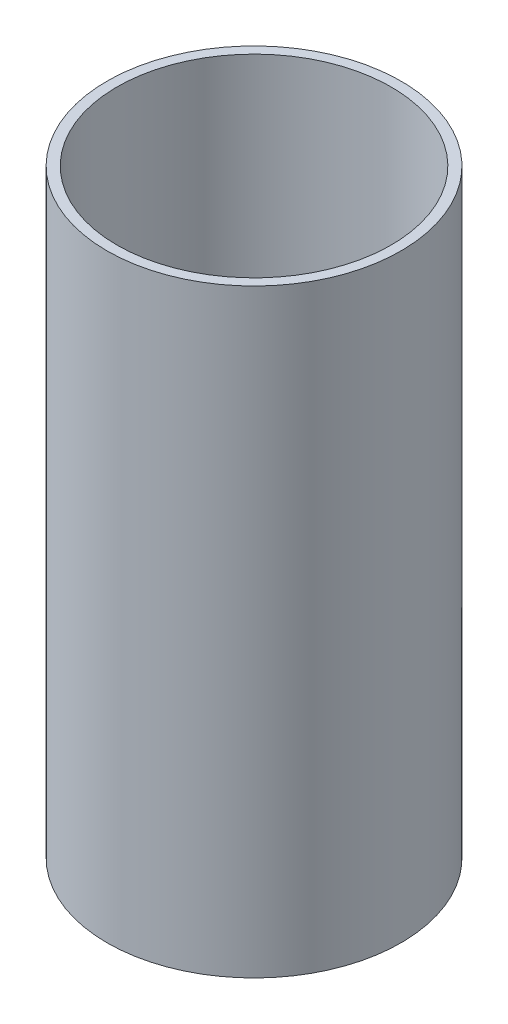
ISO-10303-21;
HEADER;
FILE_DESCRIPTION(('STEP AP214'),'2;1');
FILE_NAME('part.step','',(''),(''),'','','');
FILE_SCHEMA(('AUTOMOTIVE_DESIGN { 1 0 10303 214 1 1 1 1 }'));
ENDSEC;
DATA;
#1=APPLICATION_CONTEXT('core data for automotive mechanical design processes');
#2=APPLICATION_PROTOCOL_DEFINITION('international standard','automotive_design',2000,#1);
#3=PRODUCT_CONTEXT('',#1,'mechanical');
#4=PRODUCT('Part','Part','',(#3));
#5=PRODUCT_RELATED_PRODUCT_CATEGORY('part','',(#4));
#6=PRODUCT_DEFINITION_FORMATION('','',#4);
#7=PRODUCT_DEFINITION_CONTEXT('part definition',#1,'design');
#8=PRODUCT_DEFINITION('design','',#6,#7);
#9=PRODUCT_DEFINITION_SHAPE('','',#8);
#10=(LENGTH_UNIT() NAMED_UNIT(*) SI_UNIT(.MILLI.,.METRE.));
#11=(NAMED_UNIT(*) PLANE_ANGLE_UNIT() SI_UNIT($,.RADIAN.));
#12=(NAMED_UNIT(*) SI_UNIT($,.STERADIAN.) SOLID_ANGLE_UNIT());
#13=UNCERTAINTY_MEASURE_WITH_UNIT(LENGTH_MEASURE(1.E-05),#10,'distance_accuracy_value','');
#14=(GEOMETRIC_REPRESENTATION_CONTEXT(3) GLOBAL_UNCERTAINTY_ASSIGNED_CONTEXT((#13)) GLOBAL_UNIT_ASSIGNED_CONTEXT((#10,
#11,#12)) REPRESENTATION_CONTEXT('',''));
#15=CARTESIAN_POINT('',(0.,0.,0.));
#16=DIRECTION('',(0.,0.,1.));
#17=DIRECTION('',(1.,0.,0.));
#18=AXIS2_PLACEMENT_3D('',#15,#16,#17);
#19=CARTESIAN_POINT('',(0.,300.,0.));
#20=DIRECTION('',(0.,1.,0.));
#21=DIRECTION('',(0.,0.,1.));
#22=AXIS2_PLACEMENT_3D('',#19,#20,#21);
#23=PLANE('',#22);
#24=CARTESIAN_POINT('',(0.,300.,0.));
#25=DIRECTION('',(0.,1.,0.));
#26=DIRECTION('',(0.,0.,1.));
#27=AXIS2_PLACEMENT_3D('',#24,#25,#26);
#28=CIRCLE('',#27,73.61);
#29=CARTESIAN_POINT('',(0.,300.,73.61));
#30=VERTEX_POINT('',#29);
#31=EDGE_CURVE('E10',#30,#30,#28,.T.);
#32=ORIENTED_EDGE('',*,*,#31,.T.);
#33=EDGE_LOOP('',(#32));
#34=FACE_BOUND('',#33,.T.);
#35=CARTESIAN_POINT('',(0.,300.,0.));
#36=DIRECTION('',(0.,1.,0.));
#37=DIRECTION('',(0.,0.,1.));
#38=AXIS2_PLACEMENT_3D('',#35,#36,#37);
#39=CIRCLE('',#38,68.61);
#40=CARTESIAN_POINT('',(0.,300.,68.61));
#41=VERTEX_POINT('',#40);
#42=EDGE_CURVE('E44',#41,#41,#39,.T.);
#43=ORIENTED_EDGE('',*,*,#42,.F.);
#44=EDGE_LOOP('',(#43));
#45=FACE_BOUND('',#44,.T.);
#46=ADVANCED_FACE('F33',(#34,#45),#23,.T.);
#47=CARTESIAN_POINT('',(0.,0.,0.));
#48=DIRECTION('',(0.,1.,0.));
#49=DIRECTION('',(0.,0.,1.));
#50=AXIS2_PLACEMENT_3D('',#47,#48,#49);
#51=PLANE('',#50);
#52=CARTESIAN_POINT('',(0.,0.,0.));
#53=DIRECTION('',(0.,1.,0.));
#54=DIRECTION('',(0.,0.,1.));
#55=AXIS2_PLACEMENT_3D('',#52,#53,#54);
#56=CIRCLE('',#55,73.61);
#57=CARTESIAN_POINT('',(0.,0.,73.61));
#58=VERTEX_POINT('',#57);
#59=EDGE_CURVE('E37',#58,#58,#56,.T.);
#60=ORIENTED_EDGE('',*,*,#59,.F.);
#61=EDGE_LOOP('',(#60));
#62=FACE_BOUND('',#61,.T.);
#63=CARTESIAN_POINT('',(0.,0.,0.));
#64=DIRECTION('',(0.,1.,0.));
#65=DIRECTION('',(0.,0.,1.));
#66=AXIS2_PLACEMENT_3D('',#63,#64,#65);
#67=CIRCLE('',#66,68.61);
#68=CARTESIAN_POINT('',(0.,0.,68.61));
#69=VERTEX_POINT('',#68);
#70=EDGE_CURVE('E46',#69,#69,#67,.T.);
#71=ORIENTED_EDGE('',*,*,#70,.T.);
#72=EDGE_LOOP('',(#71));
#73=FACE_BOUND('',#72,.T.);
#74=ADVANCED_FACE('F56',(#62,#73),#51,.F.);
#75=CARTESIAN_POINT('',(0.,300.,0.));
#76=DIRECTION('',(0.,-1.,0.));
#77=DIRECTION('',(0.,0.,-1.));
#78=AXIS2_PLACEMENT_3D('',#75,#76,#77);
#79=CYLINDRICAL_SURFACE('',#78,73.61);
#80=ORIENTED_EDGE('',*,*,#31,.F.);
#81=EDGE_LOOP('',(#80));
#82=FACE_BOUND('',#81,.T.);
#83=ORIENTED_EDGE('',*,*,#59,.T.);
#84=EDGE_LOOP('',(#83));
#85=FACE_BOUND('',#84,.T.);
#86=ADVANCED_FACE('F35',(#82,#85),#79,.T.);
#87=CARTESIAN_POINT('',(0.,300.,0.));
#88=DIRECTION('',(0.,-1.,0.));
#89=DIRECTION('',(0.,0.,-1.));
#90=AXIS2_PLACEMENT_3D('',#87,#88,#89);
#91=CYLINDRICAL_SURFACE('',#90,68.61);
#92=ORIENTED_EDGE('',*,*,#42,.T.);
#93=EDGE_LOOP('',(#92));
#94=FACE_BOUND('',#93,.T.);
#95=ORIENTED_EDGE('',*,*,#70,.F.);
#96=EDGE_LOOP('',(#95));
#97=FACE_BOUND('',#96,.T.);
#98=ADVANCED_FACE('F52',(#94,#97),#91,.F.);
#99=CLOSED_SHELL('',(#46,#74,#86,#98));
#100=MANIFOLD_SOLID_BREP('B2',#99);
#101=ADVANCED_BREP_SHAPE_REPRESENTATION('',(#18,#100),#14);
#102=SHAPE_DEFINITION_REPRESENTATION(#9,#101);
ENDSEC;
END-ISO-10303-21;
